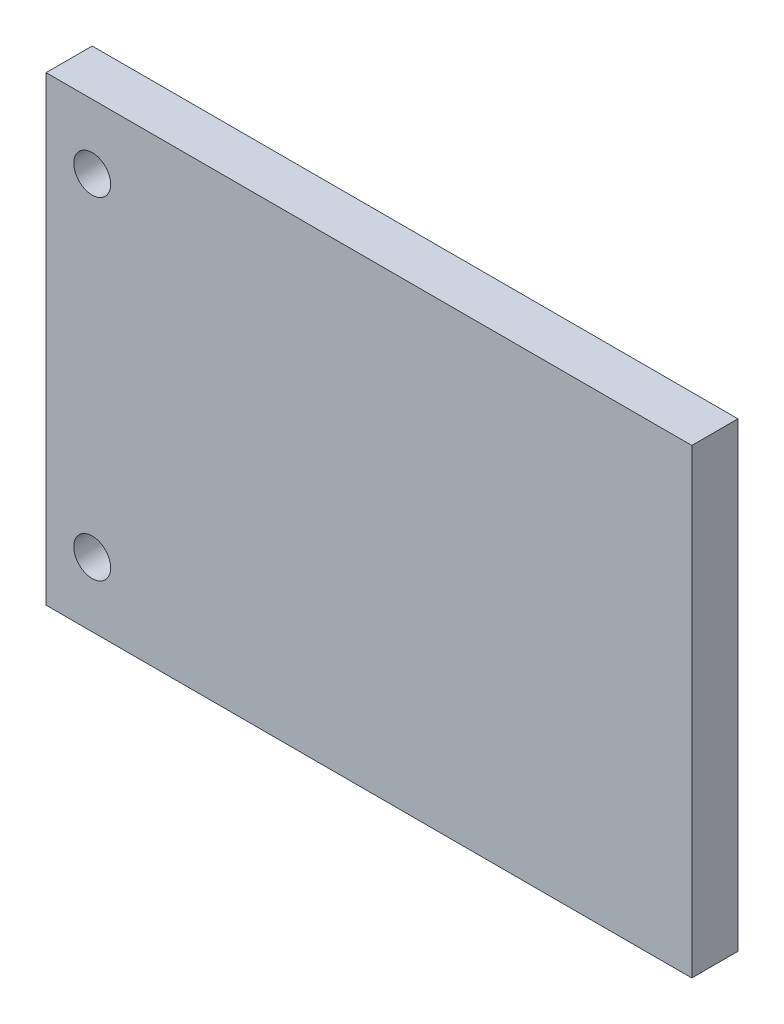
ISO-10303-21;
HEADER;
FILE_DESCRIPTION(('STEP AP214'),'2;1');
FILE_NAME('part.step','',(''),(''),'','','');
FILE_SCHEMA(('AUTOMOTIVE_DESIGN { 1 0 10303 214 1 1 1 1 }'));
ENDSEC;
DATA;
#1=APPLICATION_CONTEXT('core data for automotive mechanical design processes');
#2=APPLICATION_PROTOCOL_DEFINITION('international standard','automotive_design',2000,#1);
#3=PRODUCT_CONTEXT('',#1,'mechanical');
#4=PRODUCT('Part','Part','',(#3));
#5=PRODUCT_RELATED_PRODUCT_CATEGORY('part','',(#4));
#6=PRODUCT_DEFINITION_FORMATION('','',#4);
#7=PRODUCT_DEFINITION_CONTEXT('part definition',#1,'design');
#8=PRODUCT_DEFINITION('design','',#6,#7);
#9=PRODUCT_DEFINITION_SHAPE('','',#8);
#10=(LENGTH_UNIT() NAMED_UNIT(*) SI_UNIT(.MILLI.,.METRE.));
#11=(NAMED_UNIT(*) PLANE_ANGLE_UNIT() SI_UNIT($,.RADIAN.));
#12=(NAMED_UNIT(*) SI_UNIT($,.STERADIAN.) SOLID_ANGLE_UNIT());
#13=UNCERTAINTY_MEASURE_WITH_UNIT(LENGTH_MEASURE(1.E-05),#10,'distance_accuracy_value','');
#14=(GEOMETRIC_REPRESENTATION_CONTEXT(3) GLOBAL_UNCERTAINTY_ASSIGNED_CONTEXT((#13)) GLOBAL_UNIT_ASSIGNED_CONTEXT((#10,
#11,#12)) REPRESENTATION_CONTEXT('',''));
#15=CARTESIAN_POINT('',(0.,0.,0.));
#16=DIRECTION('',(0.,0.,1.));
#17=DIRECTION('',(1.,0.,0.));
#18=AXIS2_PLACEMENT_3D('',#15,#16,#17);
#19=CARTESIAN_POINT('',(0.,0.,5.));
#20=DIRECTION('',(0.,0.,1.));
#21=DIRECTION('',(1.,0.,0.));
#22=AXIS2_PLACEMENT_3D('',#19,#20,#21);
#23=PLANE('',#22);
#24=CARTESIAN_POINT('',(-30.,18.,5.));
#25=DIRECTION('',(0.,0.,1.));
#26=DIRECTION('',(1.,0.,0.));
#27=AXIS2_PLACEMENT_3D('',#24,#25,#26);
#28=CIRCLE('',#27,2.00000000000001);
#29=CARTESIAN_POINT('',(-28.,18.,5.));
#30=VERTEX_POINT('',#29);
#31=EDGE_CURVE('E103',#30,#30,#28,.T.);
#32=ORIENTED_EDGE('',*,*,#31,.F.);
#33=EDGE_LOOP('',(#32));
#34=FACE_BOUND('',#33,.T.);
#35=DIRECTION('',(0.,-1.,0.));
#36=VECTOR('',#35,1.);
#37=CARTESIAN_POINT('',(-35.,-25.,5.));
#38=LINE('',#37,#36);
#39=CARTESIAN_POINT('',(-35.,25.,5.));
#40=VERTEX_POINT('',#39);
#41=CARTESIAN_POINT('',(-35.,-25.,5.));
#42=VERTEX_POINT('',#41);
#43=EDGE_CURVE('E88',#40,#42,#38,.T.);
#44=ORIENTED_EDGE('',*,*,#43,.T.);
#45=DIRECTION('',(1.,0.,0.));
#46=VECTOR('',#45,1.);
#47=CARTESIAN_POINT('',(35.,-25.,5.));
#48=LINE('',#47,#46);
#49=CARTESIAN_POINT('',(35.,-25.,5.));
#50=VERTEX_POINT('',#49);
#51=EDGE_CURVE('E83',#42,#50,#48,.T.);
#52=ORIENTED_EDGE('',*,*,#51,.T.);
#53=DIRECTION('',(0.,1.,0.));
#54=VECTOR('',#53,1.);
#55=CARTESIAN_POINT('',(35.,-25.,5.));
#56=LINE('',#55,#54);
#57=CARTESIAN_POINT('',(35.,25.,5.));
#58=VERTEX_POINT('',#57);
#59=EDGE_CURVE('E86',#50,#58,#56,.T.);
#60=ORIENTED_EDGE('',*,*,#59,.T.);
#61=DIRECTION('',(-1.,0.,0.));
#62=VECTOR('',#61,1.);
#63=CARTESIAN_POINT('',(35.,25.,5.));
#64=LINE('',#63,#62);
#65=EDGE_CURVE('E53',#58,#40,#64,.T.);
#66=ORIENTED_EDGE('',*,*,#65,.T.);
#67=EDGE_LOOP('',(#44,#52,#60,#66));
#68=FACE_BOUND('',#67,.T.);
#69=CARTESIAN_POINT('',(-30.,-18.,5.));
#70=DIRECTION('',(0.,0.,1.));
#71=DIRECTION('',(-1.,0.,0.));
#72=AXIS2_PLACEMENT_3D('',#69,#70,#71);
#73=CIRCLE('',#72,2.00000000000001);
#74=CARTESIAN_POINT('',(-32.,-18.,5.));
#75=VERTEX_POINT('',#74);
#76=EDGE_CURVE('E118',#75,#75,#73,.T.);
#77=ORIENTED_EDGE('',*,*,#76,.F.);
#78=EDGE_LOOP('',(#77));
#79=FACE_BOUND('',#78,.T.);
#80=ADVANCED_FACE('F36',(#34,#68,#79),#23,.T.);
#81=CARTESIAN_POINT('',(0.,0.,0.));
#82=DIRECTION('',(0.,0.,1.));
#83=DIRECTION('',(1.,0.,0.));
#84=AXIS2_PLACEMENT_3D('',#81,#82,#83);
#85=PLANE('',#84);
#86=DIRECTION('',(0.,-1.,0.));
#87=VECTOR('',#86,1.);
#88=CARTESIAN_POINT('',(-35.,-25.,0.));
#89=LINE('',#88,#87);
#90=CARTESIAN_POINT('',(-35.,25.,0.));
#91=VERTEX_POINT('',#90);
#92=CARTESIAN_POINT('',(-35.,-25.,0.));
#93=VERTEX_POINT('',#92);
#94=EDGE_CURVE('E100',#91,#93,#89,.T.);
#95=ORIENTED_EDGE('',*,*,#94,.F.);
#96=DIRECTION('',(-1.,0.,0.));
#97=VECTOR('',#96,1.);
#98=CARTESIAN_POINT('',(35.,25.,0.));
#99=LINE('',#98,#97);
#100=CARTESIAN_POINT('',(35.,25.,0.));
#101=VERTEX_POINT('',#100);
#102=EDGE_CURVE('E76',#101,#91,#99,.T.);
#103=ORIENTED_EDGE('',*,*,#102,.F.);
#104=DIRECTION('',(0.,1.,0.));
#105=VECTOR('',#104,1.);
#106=CARTESIAN_POINT('',(35.,-25.,0.));
#107=LINE('',#106,#105);
#108=CARTESIAN_POINT('',(35.,-25.,0.));
#109=VERTEX_POINT('',#108);
#110=EDGE_CURVE('E70',#109,#101,#107,.T.);
#111=ORIENTED_EDGE('',*,*,#110,.F.);
#112=DIRECTION('',(1.,0.,0.));
#113=VECTOR('',#112,1.);
#114=CARTESIAN_POINT('',(35.,-25.,0.));
#115=LINE('',#114,#113);
#116=EDGE_CURVE('E92',#93,#109,#115,.T.);
#117=ORIENTED_EDGE('',*,*,#116,.F.);
#118=EDGE_LOOP('',(#95,#103,#111,#117));
#119=FACE_BOUND('',#118,.T.);
#120=CARTESIAN_POINT('',(-30.,18.,0.));
#121=DIRECTION('',(0.,0.,1.));
#122=DIRECTION('',(1.,0.,0.));
#123=AXIS2_PLACEMENT_3D('',#120,#121,#122);
#124=CIRCLE('',#123,2.00000000000001);
#125=CARTESIAN_POINT('',(-28.,18.,0.));
#126=VERTEX_POINT('',#125);
#127=EDGE_CURVE('E115',#126,#126,#124,.T.);
#128=ORIENTED_EDGE('',*,*,#127,.T.);
#129=EDGE_LOOP('',(#128));
#130=FACE_BOUND('',#129,.T.);
#131=CARTESIAN_POINT('',(-30.,-18.,0.));
#132=DIRECTION('',(0.,0.,1.));
#133=DIRECTION('',(-1.,0.,0.));
#134=AXIS2_PLACEMENT_3D('',#131,#132,#133);
#135=CIRCLE('',#134,2.00000000000001);
#136=CARTESIAN_POINT('',(-32.,-18.,0.));
#137=VERTEX_POINT('',#136);
#138=EDGE_CURVE('E121',#137,#137,#135,.T.);
#139=ORIENTED_EDGE('',*,*,#138,.T.);
#140=EDGE_LOOP('',(#139));
#141=FACE_BOUND('',#140,.T.);
#142=ADVANCED_FACE('F111',(#119,#130,#141),#85,.F.);
#143=CARTESIAN_POINT('',(-35.,-25.,5.));
#144=DIRECTION('',(1.,0.,0.));
#145=DIRECTION('',(0.,0.,-1.));
#146=AXIS2_PLACEMENT_3D('',#143,#144,#145);
#147=PLANE('',#146);
#148=ORIENTED_EDGE('',*,*,#94,.T.);
#149=DIRECTION('',(0.,0.,-1.));
#150=VECTOR('',#149,1.);
#151=CARTESIAN_POINT('',(-35.,-25.,5.));
#152=LINE('',#151,#150);
#153=EDGE_CURVE('E11',#42,#93,#152,.T.);
#154=ORIENTED_EDGE('',*,*,#153,.F.);
#155=ORIENTED_EDGE('',*,*,#43,.F.);
#156=DIRECTION('',(0.,0.,-1.));
#157=VECTOR('',#156,1.);
#158=CARTESIAN_POINT('',(-35.,25.,5.));
#159=LINE('',#158,#157);
#160=EDGE_CURVE('E96',#40,#91,#159,.T.);
#161=ORIENTED_EDGE('',*,*,#160,.T.);
#162=EDGE_LOOP('',(#148,#154,#155,#161));
#163=FACE_BOUND('',#162,.T.);
#164=ADVANCED_FACE('F38',(#163),#147,.F.);
#165=CARTESIAN_POINT('',(35.,-25.,5.));
#166=DIRECTION('',(0.,1.,0.));
#167=DIRECTION('',(-1.,0.,0.));
#168=AXIS2_PLACEMENT_3D('',#165,#166,#167);
#169=PLANE('',#168);
#170=ORIENTED_EDGE('',*,*,#116,.T.);
#171=DIRECTION('',(0.,0.,-1.));
#172=VECTOR('',#171,1.);
#173=CARTESIAN_POINT('',(35.,-25.,5.));
#174=LINE('',#173,#172);
#175=EDGE_CURVE('E45',#50,#109,#174,.T.);
#176=ORIENTED_EDGE('',*,*,#175,.F.);
#177=ORIENTED_EDGE('',*,*,#51,.F.);
#178=ORIENTED_EDGE('',*,*,#153,.T.);
#179=EDGE_LOOP('',(#170,#176,#177,#178));
#180=FACE_BOUND('',#179,.T.);
#181=ADVANCED_FACE('F91',(#180),#169,.F.);
#182=CARTESIAN_POINT('',(35.,-25.,5.));
#183=DIRECTION('',(-1.,0.,0.));
#184=DIRECTION('',(0.,0.,1.));
#185=AXIS2_PLACEMENT_3D('',#182,#183,#184);
#186=PLANE('',#185);
#187=ORIENTED_EDGE('',*,*,#110,.T.);
#188=DIRECTION('',(0.,0.,-1.));
#189=VECTOR('',#188,1.);
#190=CARTESIAN_POINT('',(35.,25.,5.));
#191=LINE('',#190,#189);
#192=EDGE_CURVE('E93',#58,#101,#191,.T.);
#193=ORIENTED_EDGE('',*,*,#192,.F.);
#194=ORIENTED_EDGE('',*,*,#59,.F.);
#195=ORIENTED_EDGE('',*,*,#175,.T.);
#196=EDGE_LOOP('',(#187,#193,#194,#195));
#197=FACE_BOUND('',#196,.T.);
#198=ADVANCED_FACE('F94',(#197),#186,.F.);
#199=CARTESIAN_POINT('',(35.,25.,5.));
#200=DIRECTION('',(0.,-1.,0.));
#201=DIRECTION('',(1.,0.,0.));
#202=AXIS2_PLACEMENT_3D('',#199,#200,#201);
#203=PLANE('',#202);
#204=ORIENTED_EDGE('',*,*,#102,.T.);
#205=ORIENTED_EDGE('',*,*,#160,.F.);
#206=ORIENTED_EDGE('',*,*,#65,.F.);
#207=ORIENTED_EDGE('',*,*,#192,.T.);
#208=EDGE_LOOP('',(#204,#205,#206,#207));
#209=FACE_BOUND('',#208,.T.);
#210=ADVANCED_FACE('F108',(#209),#203,.F.);
#211=CARTESIAN_POINT('',(-30.,18.,5.));
#212=DIRECTION('',(0.,0.,-1.));
#213=DIRECTION('',(-1.,0.,0.));
#214=AXIS2_PLACEMENT_3D('',#211,#212,#213);
#215=CYLINDRICAL_SURFACE('',#214,2.00000000000001);
#216=ORIENTED_EDGE('',*,*,#31,.T.);
#217=EDGE_LOOP('',(#216));
#218=FACE_BOUND('',#217,.T.);
#219=ORIENTED_EDGE('',*,*,#127,.F.);
#220=EDGE_LOOP('',(#219));
#221=FACE_BOUND('',#220,.T.);
#222=ADVANCED_FACE('F138',(#218,#221),#215,.F.);
#223=CARTESIAN_POINT('',(-30.,-18.,5.));
#224=DIRECTION('',(0.,0.,-1.));
#225=DIRECTION('',(-1.,0.,0.));
#226=AXIS2_PLACEMENT_3D('',#223,#224,#225);
#227=CYLINDRICAL_SURFACE('',#226,2.00000000000001);
#228=ORIENTED_EDGE('',*,*,#76,.T.);
#229=EDGE_LOOP('',(#228));
#230=FACE_BOUND('',#229,.T.);
#231=ORIENTED_EDGE('',*,*,#138,.F.);
#232=EDGE_LOOP('',(#231));
#233=FACE_BOUND('',#232,.T.);
#234=ADVANCED_FACE('F127',(#230,#233),#227,.F.);
#235=CLOSED_SHELL('',(#80,#142,#164,#181,#198,#210,#222,#234));
#236=MANIFOLD_SOLID_BREP('B2',#235);
#237=ADVANCED_BREP_SHAPE_REPRESENTATION('',(#18,#236),#14);
#238=SHAPE_DEFINITION_REPRESENTATION(#9,#237);
ENDSEC;
END-ISO-10303-21;
